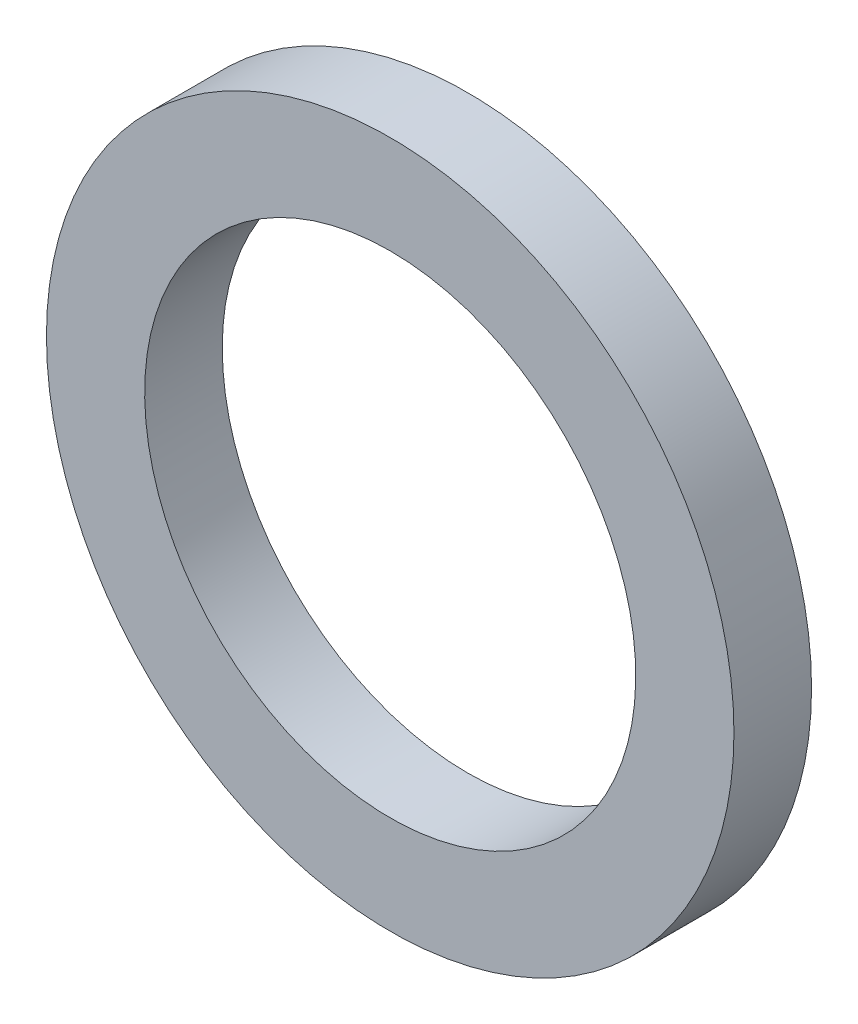
ISO-10303-21;
HEADER;
FILE_DESCRIPTION(('STEP AP214'),'2;1');
FILE_NAME('part.step','',(''),(''),'','','');
FILE_SCHEMA(('AUTOMOTIVE_DESIGN { 1 0 10303 214 1 1 1 1 }'));
ENDSEC;
DATA;
#1=APPLICATION_CONTEXT('core data for automotive mechanical design processes');
#2=APPLICATION_PROTOCOL_DEFINITION('international standard','automotive_design',2000,#1);
#3=PRODUCT_CONTEXT('',#1,'mechanical');
#4=PRODUCT('Part','Part','',(#3));
#5=PRODUCT_RELATED_PRODUCT_CATEGORY('part','',(#4));
#6=PRODUCT_DEFINITION_FORMATION('','',#4);
#7=PRODUCT_DEFINITION_CONTEXT('part definition',#1,'design');
#8=PRODUCT_DEFINITION('design','',#6,#7);
#9=PRODUCT_DEFINITION_SHAPE('','',#8);
#10=(LENGTH_UNIT() NAMED_UNIT(*) SI_UNIT(.MILLI.,.METRE.));
#11=(NAMED_UNIT(*) PLANE_ANGLE_UNIT() SI_UNIT($,.RADIAN.));
#12=(NAMED_UNIT(*) SI_UNIT($,.STERADIAN.) SOLID_ANGLE_UNIT());
#13=UNCERTAINTY_MEASURE_WITH_UNIT(LENGTH_MEASURE(1.E-05),#10,'distance_accuracy_value','');
#14=(GEOMETRIC_REPRESENTATION_CONTEXT(3) GLOBAL_UNCERTAINTY_ASSIGNED_CONTEXT((#13)) GLOBAL_UNIT_ASSIGNED_CONTEXT((#10,
#11,#12)) REPRESENTATION_CONTEXT('',''));
#15=CARTESIAN_POINT('',(0.,0.,0.));
#16=DIRECTION('',(0.,0.,1.));
#17=DIRECTION('',(1.,0.,0.));
#18=AXIS2_PLACEMENT_3D('',#15,#16,#17);
#19=CARTESIAN_POINT('',(0.,0.,0.));
#20=DIRECTION('',(0.,0.,1.));
#21=DIRECTION('',(1.,0.,0.));
#22=AXIS2_PLACEMENT_3D('',#19,#20,#21);
#23=PLANE('',#22);
#24=CARTESIAN_POINT('',(0.,0.,0.));
#25=DIRECTION('',(0.,0.,1.));
#26=DIRECTION('',(1.,0.,0.));
#27=AXIS2_PLACEMENT_3D('',#24,#25,#26);
#28=CIRCLE('',#27,11.1125);
#29=CARTESIAN_POINT('',(11.1125,0.,0.));
#30=VERTEX_POINT('',#29);
#31=EDGE_CURVE('E43',#30,#30,#28,.T.);
#32=ORIENTED_EDGE('',*,*,#31,.F.);
#33=EDGE_LOOP('',(#32));
#34=FACE_BOUND('',#33,.T.);
#35=CARTESIAN_POINT('',(0.,0.,0.));
#36=DIRECTION('',(0.,0.,1.));
#37=DIRECTION('',(1.,0.,0.));
#38=AXIS2_PLACEMENT_3D('',#35,#36,#37);
#39=CIRCLE('',#38,7.9375);
#40=CARTESIAN_POINT('',(7.9375,0.,0.));
#41=VERTEX_POINT('',#40);
#42=EDGE_CURVE('E45',#41,#41,#39,.T.);
#43=ORIENTED_EDGE('',*,*,#42,.T.);
#44=EDGE_LOOP('',(#43));
#45=FACE_BOUND('',#44,.T.);
#46=ADVANCED_FACE('F31',(#34,#45),#23,.F.);
#47=CARTESIAN_POINT('',(0.,0.,33.938994023742));
#48=DIRECTION('',(0.,0.,-1.));
#49=DIRECTION('',(-1.,0.,0.));
#50=AXIS2_PLACEMENT_3D('',#47,#48,#49);
#51=CYLINDRICAL_SURFACE('',#50,11.1125);
#52=CARTESIAN_POINT('',(0.,0.,2.5080976));
#53=DIRECTION('',(0.,0.,-1.));
#54=DIRECTION('',(-1.,0.,0.));
#55=AXIS2_PLACEMENT_3D('',#52,#53,#54);
#56=CIRCLE('',#55,11.1125);
#57=CARTESIAN_POINT('',(-11.1125,0.,2.5080976));
#58=VERTEX_POINT('',#57);
#59=EDGE_CURVE('E10',#58,#58,#56,.T.);
#60=ORIENTED_EDGE('',*,*,#59,.T.);
#61=EDGE_LOOP('',(#60));
#62=FACE_BOUND('',#61,.T.);
#63=ORIENTED_EDGE('',*,*,#31,.T.);
#64=EDGE_LOOP('',(#63));
#65=FACE_BOUND('',#64,.T.);
#66=ADVANCED_FACE('F33',(#62,#65),#51,.T.);
#67=CARTESIAN_POINT('',(0.,0.,33.938994023742));
#68=DIRECTION('',(0.,0.,-1.));
#69=DIRECTION('',(-1.,0.,0.));
#70=AXIS2_PLACEMENT_3D('',#67,#68,#69);
#71=CYLINDRICAL_SURFACE('',#70,7.9375);
#72=CARTESIAN_POINT('',(0.,0.,2.5080976));
#73=DIRECTION('',(0.,0.,-1.));
#74=DIRECTION('',(0.,1.,0.));
#75=AXIS2_PLACEMENT_3D('',#72,#73,#74);
#76=CIRCLE('',#75,7.9375);
#77=CARTESIAN_POINT('',(0.,7.9375,2.5080976));
#78=VERTEX_POINT('',#77);
#79=EDGE_CURVE('E35',#78,#78,#76,.T.);
#80=ORIENTED_EDGE('',*,*,#79,.F.);
#81=EDGE_LOOP('',(#80));
#82=FACE_BOUND('',#81,.T.);
#83=ORIENTED_EDGE('',*,*,#42,.F.);
#84=EDGE_LOOP('',(#83));
#85=FACE_BOUND('',#84,.T.);
#86=ADVANCED_FACE('F55',(#82,#85),#71,.F.);
#87=CARTESIAN_POINT('',(0.,0.,2.5080976));
#88=DIRECTION('',(0.,0.,-1.));
#89=DIRECTION('',(-1.,0.,0.));
#90=AXIS2_PLACEMENT_3D('',#87,#88,#89);
#91=PLANE('',#90);
#92=ORIENTED_EDGE('',*,*,#79,.T.);
#93=EDGE_LOOP('',(#92));
#94=FACE_BOUND('',#93,.T.);
#95=ORIENTED_EDGE('',*,*,#59,.F.);
#96=EDGE_LOOP('',(#95));
#97=FACE_BOUND('',#96,.T.);
#98=ADVANCED_FACE('F57',(#94,#97),#91,.F.);
#99=CLOSED_SHELL('',(#46,#66,#86,#98));
#100=MANIFOLD_SOLID_BREP('B2',#99);
#101=ADVANCED_BREP_SHAPE_REPRESENTATION('',(#18,#100),#14);
#102=SHAPE_DEFINITION_REPRESENTATION(#9,#101);
ENDSEC;
END-ISO-10303-21;
